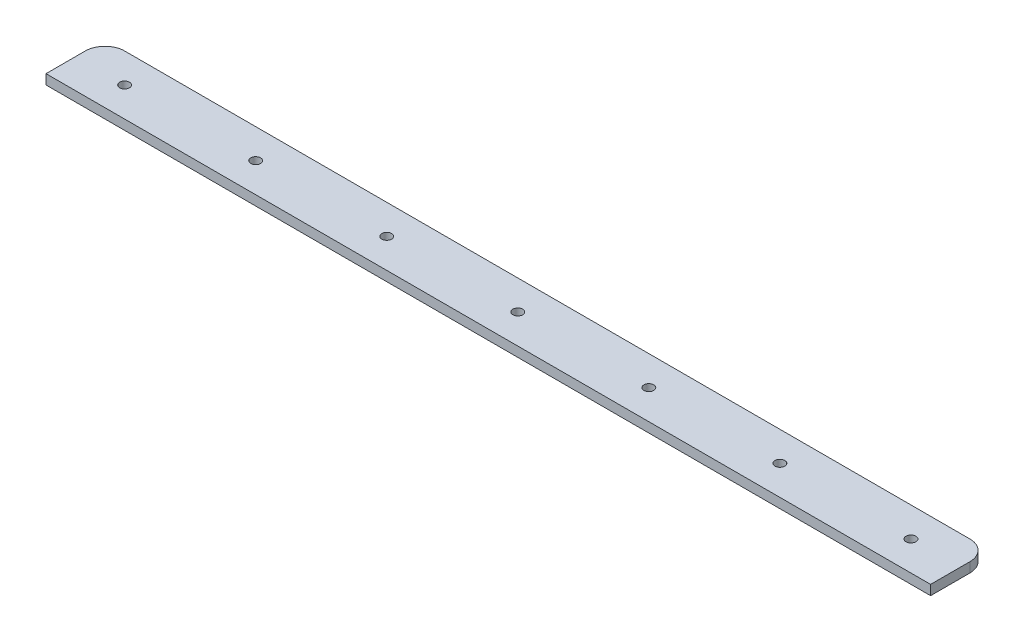
ISO-10303-21;
HEADER;
FILE_DESCRIPTION(('STEP AP214'),'2;1');
FILE_NAME('part.step','',(''),(''),'','','');
FILE_SCHEMA(('AUTOMOTIVE_DESIGN { 1 0 10303 214 1 1 1 1 }'));
ENDSEC;
DATA;
#1=APPLICATION_CONTEXT('core data for automotive mechanical design processes');
#2=APPLICATION_PROTOCOL_DEFINITION('international standard','automotive_design',2000,#1);
#3=PRODUCT_CONTEXT('',#1,'mechanical');
#4=PRODUCT('Part','Part','',(#3));
#5=PRODUCT_RELATED_PRODUCT_CATEGORY('part','',(#4));
#6=PRODUCT_DEFINITION_FORMATION('','',#4);
#7=PRODUCT_DEFINITION_CONTEXT('part definition',#1,'design');
#8=PRODUCT_DEFINITION('design','',#6,#7);
#9=PRODUCT_DEFINITION_SHAPE('','',#8);
#10=(LENGTH_UNIT() NAMED_UNIT(*) SI_UNIT(.MILLI.,.METRE.));
#11=(NAMED_UNIT(*) PLANE_ANGLE_UNIT() SI_UNIT($,.RADIAN.));
#12=(NAMED_UNIT(*) SI_UNIT($,.STERADIAN.) SOLID_ANGLE_UNIT());
#13=UNCERTAINTY_MEASURE_WITH_UNIT(LENGTH_MEASURE(1.E-05),#10,'distance_accuracy_value','');
#14=(GEOMETRIC_REPRESENTATION_CONTEXT(3) GLOBAL_UNCERTAINTY_ASSIGNED_CONTEXT((#13)) GLOBAL_UNIT_ASSIGNED_CONTEXT((#10,
#11,#12)) REPRESENTATION_CONTEXT('',''));
#15=CARTESIAN_POINT('',(0.,0.,0.));
#16=DIRECTION('',(0.,0.,1.));
#17=DIRECTION('',(1.,0.,0.));
#18=AXIS2_PLACEMENT_3D('',#15,#16,#17);
#19=CARTESIAN_POINT('',(-750.,7.5,17.7838602817301));
#20=DIRECTION('',(1.,0.,0.));
#21=DIRECTION('',(0.,0.,-1.));
#22=AXIS2_PLACEMENT_3D('',#19,#20,#21);
#23=PLANE('',#22);
#24=DIRECTION('',(0.,0.,1.));
#25=VECTOR('',#24,1.);
#26=CARTESIAN_POINT('',(-750.,-7.5,17.7838602817301));
#27=LINE('',#26,#25);
#28=CARTESIAN_POINT('',(-750.,-7.5,-42.2161397182699));
#29=VERTEX_POINT('',#28);
#30=CARTESIAN_POINT('',(-750.,-7.5,17.7838602817301));
#31=VERTEX_POINT('',#30);
#32=EDGE_CURVE('E121',#29,#31,#27,.T.);
#33=ORIENTED_EDGE('',*,*,#32,.T.);
#34=DIRECTION('',(0.,-1.,0.));
#35=VECTOR('',#34,1.);
#36=CARTESIAN_POINT('',(-750.,7.5,17.7838602817301));
#37=LINE('',#36,#35);
#38=CARTESIAN_POINT('',(-750.,7.5,17.7838602817301));
#39=VERTEX_POINT('',#38);
#40=EDGE_CURVE('E11',#39,#31,#37,.T.);
#41=ORIENTED_EDGE('',*,*,#40,.F.);
#42=DIRECTION('',(0.,0.,1.));
#43=VECTOR('',#42,1.);
#44=CARTESIAN_POINT('',(-750.,7.5,17.7838602817301));
#45=LINE('',#44,#43);
#46=CARTESIAN_POINT('',(-750.,7.5,-42.2161397182699));
#47=VERTEX_POINT('',#46);
#48=EDGE_CURVE('E132',#47,#39,#45,.T.);
#49=ORIENTED_EDGE('',*,*,#48,.F.);
#50=DIRECTION('',(0.,-1.,0.));
#51=VECTOR('',#50,1.);
#52=CARTESIAN_POINT('',(-750.,7.5,-42.2161397182699));
#53=LINE('',#52,#51);
#54=EDGE_CURVE('E117',#47,#29,#53,.T.);
#55=ORIENTED_EDGE('',*,*,#54,.T.);
#56=EDGE_LOOP('',(#33,#41,#49,#55));
#57=FACE_BOUND('',#56,.T.);
#58=ADVANCED_FACE('F37',(#57),#23,.F.);
#59=CARTESIAN_POINT('',(-750.,7.5,17.7838602817301));
#60=DIRECTION('',(0.,0.,-1.));
#61=DIRECTION('',(-1.,0.,0.));
#62=AXIS2_PLACEMENT_3D('',#59,#60,#61);
#63=PLANE('',#62);
#64=DIRECTION('',(1.,0.,0.));
#65=VECTOR('',#64,1.);
#66=CARTESIAN_POINT('',(-750.,-7.5,17.7838602817301));
#67=LINE('',#66,#65);
#68=CARTESIAN_POINT('',(600.,-7.5,17.7838602817301));
#69=VERTEX_POINT('',#68);
#70=EDGE_CURVE('E124',#31,#69,#67,.T.);
#71=ORIENTED_EDGE('',*,*,#70,.T.);
#72=DIRECTION('',(0.,-1.,0.));
#73=VECTOR('',#72,1.);
#74=CARTESIAN_POINT('',(600.,7.5,17.7838602817301));
#75=LINE('',#74,#73);
#76=CARTESIAN_POINT('',(600.,7.5,17.7838602817301));
#77=VERTEX_POINT('',#76);
#78=EDGE_CURVE('E45',#77,#69,#75,.T.);
#79=ORIENTED_EDGE('',*,*,#78,.F.);
#80=DIRECTION('',(1.,0.,0.));
#81=VECTOR('',#80,1.);
#82=CARTESIAN_POINT('',(-750.,7.5,17.7838602817301));
#83=LINE('',#82,#81);
#84=EDGE_CURVE('E90',#39,#77,#83,.T.);
#85=ORIENTED_EDGE('',*,*,#84,.F.);
#86=ORIENTED_EDGE('',*,*,#40,.T.);
#87=EDGE_LOOP('',(#71,#79,#85,#86));
#88=FACE_BOUND('',#87,.T.);
#89=ADVANCED_FACE('F157',(#88),#63,.F.);
#90=CARTESIAN_POINT('',(600.,7.5,17.7838602817301));
#91=DIRECTION('',(-1.,0.,0.));
#92=DIRECTION('',(0.,0.,1.));
#93=AXIS2_PLACEMENT_3D('',#90,#91,#92);
#94=PLANE('',#93);
#95=DIRECTION('',(0.,0.,-1.));
#96=VECTOR('',#95,1.);
#97=CARTESIAN_POINT('',(600.,-7.5,17.7838602817301));
#98=LINE('',#97,#96);
#99=CARTESIAN_POINT('',(600.,-7.5,-42.2161397182699));
#100=VERTEX_POINT('',#99);
#101=EDGE_CURVE('E127',#69,#100,#98,.T.);
#102=ORIENTED_EDGE('',*,*,#101,.T.);
#103=DIRECTION('',(0.,-1.,0.));
#104=VECTOR('',#103,1.);
#105=CARTESIAN_POINT('',(600.,7.5,-42.2161397182699));
#106=LINE('',#105,#104);
#107=CARTESIAN_POINT('',(600.,7.5,-42.2161397182699));
#108=VERTEX_POINT('',#107);
#109=EDGE_CURVE('E112',#108,#100,#106,.T.);
#110=ORIENTED_EDGE('',*,*,#109,.F.);
#111=DIRECTION('',(0.,0.,-1.));
#112=VECTOR('',#111,1.);
#113=CARTESIAN_POINT('',(600.,7.5,17.7838602817301));
#114=LINE('',#113,#112);
#115=EDGE_CURVE('E103',#77,#108,#114,.T.);
#116=ORIENTED_EDGE('',*,*,#115,.F.);
#117=ORIENTED_EDGE('',*,*,#78,.T.);
#118=EDGE_LOOP('',(#102,#110,#116,#117));
#119=FACE_BOUND('',#118,.T.);
#120=ADVANCED_FACE('F138',(#119),#94,.F.);
#121=CARTESIAN_POINT('',(570.,7.5,-42.2161397182699));
#122=DIRECTION('',(0.,-1.,0.));
#123=DIRECTION('',(0.,0.,-1.));
#124=AXIS2_PLACEMENT_3D('',#121,#122,#123);
#125=CYLINDRICAL_SURFACE('',#124,30.0000000000001);
#126=CARTESIAN_POINT('',(570.,-7.5,-42.2161397182699));
#127=DIRECTION('',(0.,1.,0.));
#128=DIRECTION('',(0.,0.,-1.));
#129=AXIS2_PLACEMENT_3D('',#126,#127,#128);
#130=CIRCLE('',#129,30.0000000000001);
#131=CARTESIAN_POINT('',(570.,-7.5,-72.21613971827));
#132=VERTEX_POINT('',#131);
#133=EDGE_CURVE('E111',#100,#132,#130,.T.);
#134=ORIENTED_EDGE('',*,*,#133,.T.);
#135=DIRECTION('',(0.,-1.,0.));
#136=VECTOR('',#135,1.);
#137=CARTESIAN_POINT('',(570.,7.5,-72.21613971827));
#138=LINE('',#137,#136);
#139=CARTESIAN_POINT('',(570.,7.5,-72.21613971827));
#140=VERTEX_POINT('',#139);
#141=EDGE_CURVE('E108',#140,#132,#138,.T.);
#142=ORIENTED_EDGE('',*,*,#141,.F.);
#143=CARTESIAN_POINT('',(570.,7.5,-42.2161397182699));
#144=DIRECTION('',(0.,1.,0.));
#145=DIRECTION('',(0.,0.,-1.));
#146=AXIS2_PLACEMENT_3D('',#143,#144,#145);
#147=CIRCLE('',#146,30.0000000000001);
#148=EDGE_CURVE('E97',#108,#140,#147,.T.);
#149=ORIENTED_EDGE('',*,*,#148,.F.);
#150=ORIENTED_EDGE('',*,*,#109,.T.);
#151=EDGE_LOOP('',(#134,#142,#149,#150));
#152=FACE_BOUND('',#151,.T.);
#153=ADVANCED_FACE('F109',(#152),#125,.T.);
#154=CARTESIAN_POINT('',(-720.,7.5,-72.2161397182699));
#155=DIRECTION('',(0.,0.,1.));
#156=DIRECTION('',(1.,0.,0.));
#157=AXIS2_PLACEMENT_3D('',#154,#155,#156);
#158=PLANE('',#157);
#159=DIRECTION('',(-1.,0.,0.));
#160=VECTOR('',#159,1.);
#161=CARTESIAN_POINT('',(-720.,-7.5,-72.2161397182699));
#162=LINE('',#161,#160);
#163=CARTESIAN_POINT('',(-720.,-7.5,-72.2161397182699));
#164=VERTEX_POINT('',#163);
#165=EDGE_CURVE('E76',#132,#164,#162,.T.);
#166=ORIENTED_EDGE('',*,*,#165,.T.);
#167=DIRECTION('',(0.,-1.,0.));
#168=VECTOR('',#167,1.);
#169=CARTESIAN_POINT('',(-720.,7.5,-72.2161397182699));
#170=LINE('',#169,#168);
#171=CARTESIAN_POINT('',(-720.,7.5,-72.2161397182699));
#172=VERTEX_POINT('',#171);
#173=EDGE_CURVE('E113',#172,#164,#170,.T.);
#174=ORIENTED_EDGE('',*,*,#173,.F.);
#175=DIRECTION('',(-1.,0.,0.));
#176=VECTOR('',#175,1.);
#177=CARTESIAN_POINT('',(-720.,7.5,-72.2161397182699));
#178=LINE('',#177,#176);
#179=EDGE_CURVE('E101',#140,#172,#178,.T.);
#180=ORIENTED_EDGE('',*,*,#179,.F.);
#181=ORIENTED_EDGE('',*,*,#141,.T.);
#182=EDGE_LOOP('',(#166,#174,#180,#181));
#183=FACE_BOUND('',#182,.T.);
#184=ADVANCED_FACE('F115',(#183),#158,.F.);
#185=CARTESIAN_POINT('',(-720.,7.5,-42.2161397182699));
#186=DIRECTION('',(0.,-1.,0.));
#187=DIRECTION('',(0.,0.,-1.));
#188=AXIS2_PLACEMENT_3D('',#185,#186,#187);
#189=CYLINDRICAL_SURFACE('',#188,30.);
#190=CARTESIAN_POINT('',(-720.,-7.5,-42.2161397182699));
#191=DIRECTION('',(0.,1.,0.));
#192=DIRECTION('',(0.,0.,-1.));
#193=AXIS2_PLACEMENT_3D('',#190,#191,#192);
#194=CIRCLE('',#193,30.);
#195=EDGE_CURVE('E82',#164,#29,#194,.T.);
#196=ORIENTED_EDGE('',*,*,#195,.T.);
#197=ORIENTED_EDGE('',*,*,#54,.F.);
#198=CARTESIAN_POINT('',(-720.,7.5,-42.2161397182699));
#199=DIRECTION('',(0.,1.,0.));
#200=DIRECTION('',(0.,0.,-1.));
#201=AXIS2_PLACEMENT_3D('',#198,#199,#200);
#202=CIRCLE('',#201,30.);
#203=EDGE_CURVE('E53',#172,#47,#202,.T.);
#204=ORIENTED_EDGE('',*,*,#203,.F.);
#205=ORIENTED_EDGE('',*,*,#173,.T.);
#206=EDGE_LOOP('',(#196,#197,#204,#205));
#207=FACE_BOUND('',#206,.T.);
#208=ADVANCED_FACE('F145',(#207),#189,.T.);
#209=CARTESIAN_POINT('',(-720.,7.5,-42.2161397182699));
#210=DIRECTION('',(0.,-1.,0.));
#211=DIRECTION('',(0.,0.,-1.));
#212=AXIS2_PLACEMENT_3D('',#209,#210,#211);
#213=PLANE('',#212);
#214=CARTESIAN_POINT('',(-675.,7.5,-27.21613971827));
#215=DIRECTION('',(0.,-1.,0.));
#216=DIRECTION('',(0.,0.,-1.));
#217=AXIS2_PLACEMENT_3D('',#214,#215,#216);
#218=CIRCLE('',#217,7.49999999999995);
#219=CARTESIAN_POINT('',(-675.,7.5,-34.7161397182699));
#220=VERTEX_POINT('',#219);
#221=EDGE_CURVE('E125',#220,#220,#218,.T.);
#222=ORIENTED_EDGE('',*,*,#221,.T.);
#223=EDGE_LOOP('',(#222));
#224=FACE_BOUND('',#223,.T.);
#225=CARTESIAN_POINT('',(-475.,7.5,-27.21613971827));
#226=DIRECTION('',(0.,-1.,0.));
#227=DIRECTION('',(0.,0.,-1.));
#228=AXIS2_PLACEMENT_3D('',#225,#226,#227);
#229=CIRCLE('',#228,7.50000000000007);
#230=CARTESIAN_POINT('',(-475.,7.5,-34.71613971827));
#231=VERTEX_POINT('',#230);
#232=EDGE_CURVE('E321',#231,#231,#229,.T.);
#233=ORIENTED_EDGE('',*,*,#232,.T.);
#234=EDGE_LOOP('',(#233));
#235=FACE_BOUND('',#234,.T.);
#236=CARTESIAN_POINT('',(-275.,7.5,-27.21613971827));
#237=DIRECTION('',(0.,-1.,0.));
#238=DIRECTION('',(0.,0.,-1.));
#239=AXIS2_PLACEMENT_3D('',#236,#237,#238);
#240=CIRCLE('',#239,7.50000000000001);
#241=CARTESIAN_POINT('',(-275.,7.5,-34.71613971827));
#242=VERTEX_POINT('',#241);
#243=EDGE_CURVE('E329',#242,#242,#240,.T.);
#244=ORIENTED_EDGE('',*,*,#243,.T.);
#245=EDGE_LOOP('',(#244));
#246=FACE_BOUND('',#245,.T.);
#247=CARTESIAN_POINT('',(-75.0000000000002,7.5,-27.21613971827));
#248=DIRECTION('',(0.,-1.,0.));
#249=DIRECTION('',(0.,0.,-1.));
#250=AXIS2_PLACEMENT_3D('',#247,#248,#249);
#251=CIRCLE('',#250,7.50000000000001);
#252=CARTESIAN_POINT('',(-75.0000000000002,7.5,-34.71613971827));
#253=VERTEX_POINT('',#252);
#254=EDGE_CURVE('E335',#253,#253,#251,.T.);
#255=ORIENTED_EDGE('',*,*,#254,.T.);
#256=EDGE_LOOP('',(#255));
#257=FACE_BOUND('',#256,.T.);
#258=CARTESIAN_POINT('',(125.,7.5,-27.21613971827));
#259=DIRECTION('',(0.,-1.,0.));
#260=DIRECTION('',(0.,0.,-1.));
#261=AXIS2_PLACEMENT_3D('',#258,#259,#260);
#262=CIRCLE('',#261,7.50000000000001);
#263=CARTESIAN_POINT('',(125.,7.5,-34.71613971827));
#264=VERTEX_POINT('',#263);
#265=EDGE_CURVE('E341',#264,#264,#262,.T.);
#266=ORIENTED_EDGE('',*,*,#265,.T.);
#267=EDGE_LOOP('',(#266));
#268=FACE_BOUND('',#267,.T.);
#269=CARTESIAN_POINT('',(325.,7.5,-27.21613971827));
#270=DIRECTION('',(0.,-1.,0.));
#271=DIRECTION('',(0.,0.,-1.));
#272=AXIS2_PLACEMENT_3D('',#269,#270,#271);
#273=CIRCLE('',#272,7.50000000000001);
#274=CARTESIAN_POINT('',(325.,7.5,-34.71613971827));
#275=VERTEX_POINT('',#274);
#276=EDGE_CURVE('E347',#275,#275,#273,.T.);
#277=ORIENTED_EDGE('',*,*,#276,.T.);
#278=EDGE_LOOP('',(#277));
#279=FACE_BOUND('',#278,.T.);
#280=CARTESIAN_POINT('',(525.,7.5,-27.21613971827));
#281=DIRECTION('',(0.,-1.,0.));
#282=DIRECTION('',(0.,0.,-1.));
#283=AXIS2_PLACEMENT_3D('',#280,#281,#282);
#284=CIRCLE('',#283,7.50000000000007);
#285=CARTESIAN_POINT('',(525.,7.5,-34.71613971827));
#286=VERTEX_POINT('',#285);
#287=EDGE_CURVE('E353',#286,#286,#284,.T.);
#288=ORIENTED_EDGE('',*,*,#287,.T.);
#289=EDGE_LOOP('',(#288));
#290=FACE_BOUND('',#289,.T.);
#291=ORIENTED_EDGE('',*,*,#48,.T.);
#292=ORIENTED_EDGE('',*,*,#84,.T.);
#293=ORIENTED_EDGE('',*,*,#115,.T.);
#294=ORIENTED_EDGE('',*,*,#148,.T.);
#295=ORIENTED_EDGE('',*,*,#179,.T.);
#296=ORIENTED_EDGE('',*,*,#203,.T.);
#297=EDGE_LOOP('',(#291,#292,#293,#294,#295,#296));
#298=FACE_BOUND('',#297,.T.);
#299=ADVANCED_FACE('F99',(#224,#235,#246,#257,#268,#279,#290,#298),#213,.F.);
#300=CARTESIAN_POINT('',(-720.,-7.5,-42.2161397182699));
#301=DIRECTION('',(0.,-1.,0.));
#302=DIRECTION('',(0.,0.,-1.));
#303=AXIS2_PLACEMENT_3D('',#300,#301,#302);
#304=PLANE('',#303);
#305=CARTESIAN_POINT('',(-675.,-7.5,-27.21613971827));
#306=DIRECTION('',(0.,-1.,0.));
#307=DIRECTION('',(0.,0.,-1.));
#308=AXIS2_PLACEMENT_3D('',#305,#306,#307);
#309=CIRCLE('',#308,7.49999999999995);
#310=CARTESIAN_POINT('',(-675.,-7.5,-34.7161397182699));
#311=VERTEX_POINT('',#310);
#312=EDGE_CURVE('E316',#311,#311,#309,.T.);
#313=ORIENTED_EDGE('',*,*,#312,.F.);
#314=EDGE_LOOP('',(#313));
#315=FACE_BOUND('',#314,.T.);
#316=CARTESIAN_POINT('',(-475.,-7.5,-27.21613971827));
#317=DIRECTION('',(0.,-1.,0.));
#318=DIRECTION('',(0.,0.,-1.));
#319=AXIS2_PLACEMENT_3D('',#316,#317,#318);
#320=CIRCLE('',#319,7.50000000000007);
#321=CARTESIAN_POINT('',(-475.,-7.5,-34.71613971827));
#322=VERTEX_POINT('',#321);
#323=EDGE_CURVE('E317',#322,#322,#320,.T.);
#324=ORIENTED_EDGE('',*,*,#323,.F.);
#325=EDGE_LOOP('',(#324));
#326=FACE_BOUND('',#325,.T.);
#327=CARTESIAN_POINT('',(-275.,-7.5,-27.21613971827));
#328=DIRECTION('',(0.,-1.,0.));
#329=DIRECTION('',(0.,0.,-1.));
#330=AXIS2_PLACEMENT_3D('',#327,#328,#329);
#331=CIRCLE('',#330,7.50000000000001);
#332=CARTESIAN_POINT('',(-275.,-7.5,-34.71613971827));
#333=VERTEX_POINT('',#332);
#334=EDGE_CURVE('E326',#333,#333,#331,.T.);
#335=ORIENTED_EDGE('',*,*,#334,.F.);
#336=EDGE_LOOP('',(#335));
#337=FACE_BOUND('',#336,.T.);
#338=CARTESIAN_POINT('',(-75.0000000000002,-7.5,-27.21613971827));
#339=DIRECTION('',(0.,-1.,0.));
#340=DIRECTION('',(0.,0.,-1.));
#341=AXIS2_PLACEMENT_3D('',#338,#339,#340);
#342=CIRCLE('',#341,7.50000000000001);
#343=CARTESIAN_POINT('',(-75.0000000000002,-7.5,-34.71613971827));
#344=VERTEX_POINT('',#343);
#345=EDGE_CURVE('E332',#344,#344,#342,.T.);
#346=ORIENTED_EDGE('',*,*,#345,.F.);
#347=EDGE_LOOP('',(#346));
#348=FACE_BOUND('',#347,.T.);
#349=CARTESIAN_POINT('',(125.,-7.5,-27.21613971827));
#350=DIRECTION('',(0.,-1.,0.));
#351=DIRECTION('',(0.,0.,-1.));
#352=AXIS2_PLACEMENT_3D('',#349,#350,#351);
#353=CIRCLE('',#352,7.50000000000001);
#354=CARTESIAN_POINT('',(125.,-7.5,-34.71613971827));
#355=VERTEX_POINT('',#354);
#356=EDGE_CURVE('E338',#355,#355,#353,.T.);
#357=ORIENTED_EDGE('',*,*,#356,.F.);
#358=EDGE_LOOP('',(#357));
#359=FACE_BOUND('',#358,.T.);
#360=CARTESIAN_POINT('',(325.,-7.5,-27.21613971827));
#361=DIRECTION('',(0.,-1.,0.));
#362=DIRECTION('',(0.,0.,-1.));
#363=AXIS2_PLACEMENT_3D('',#360,#361,#362);
#364=CIRCLE('',#363,7.50000000000001);
#365=CARTESIAN_POINT('',(325.,-7.5,-34.71613971827));
#366=VERTEX_POINT('',#365);
#367=EDGE_CURVE('E344',#366,#366,#364,.T.);
#368=ORIENTED_EDGE('',*,*,#367,.F.);
#369=EDGE_LOOP('',(#368));
#370=FACE_BOUND('',#369,.T.);
#371=CARTESIAN_POINT('',(525.,-7.5,-27.21613971827));
#372=DIRECTION('',(0.,-1.,0.));
#373=DIRECTION('',(0.,0.,-1.));
#374=AXIS2_PLACEMENT_3D('',#371,#372,#373);
#375=CIRCLE('',#374,7.50000000000007);
#376=CARTESIAN_POINT('',(525.,-7.5,-34.71613971827));
#377=VERTEX_POINT('',#376);
#378=EDGE_CURVE('E350',#377,#377,#375,.T.);
#379=ORIENTED_EDGE('',*,*,#378,.F.);
#380=EDGE_LOOP('',(#379));
#381=FACE_BOUND('',#380,.T.);
#382=ORIENTED_EDGE('',*,*,#32,.F.);
#383=ORIENTED_EDGE('',*,*,#195,.F.);
#384=ORIENTED_EDGE('',*,*,#165,.F.);
#385=ORIENTED_EDGE('',*,*,#133,.F.);
#386=ORIENTED_EDGE('',*,*,#101,.F.);
#387=ORIENTED_EDGE('',*,*,#70,.F.);
#388=EDGE_LOOP('',(#382,#383,#384,#385,#386,#387));
#389=FACE_BOUND('',#388,.T.);
#390=ADVANCED_FACE('F141',(#315,#326,#337,#348,#359,#370,#381,#389),#304,.T.);
#391=CARTESIAN_POINT('',(525.,7.5,-27.21613971827));
#392=DIRECTION('',(0.,-1.,0.));
#393=DIRECTION('',(0.,0.,-1.));
#394=AXIS2_PLACEMENT_3D('',#391,#392,#393);
#395=CYLINDRICAL_SURFACE('',#394,7.50000000000007);
#396=ORIENTED_EDGE('',*,*,#287,.F.);
#397=EDGE_LOOP('',(#396));
#398=FACE_BOUND('',#397,.T.);
#399=ORIENTED_EDGE('',*,*,#378,.T.);
#400=EDGE_LOOP('',(#399));
#401=FACE_BOUND('',#400,.T.);
#402=ADVANCED_FACE('F197',(#398,#401),#395,.F.);
#403=CARTESIAN_POINT('',(325.,7.5,-27.21613971827));
#404=DIRECTION('',(0.,-1.,0.));
#405=DIRECTION('',(0.,0.,-1.));
#406=AXIS2_PLACEMENT_3D('',#403,#404,#405);
#407=CYLINDRICAL_SURFACE('',#406,7.50000000000001);
#408=ORIENTED_EDGE('',*,*,#276,.F.);
#409=EDGE_LOOP('',(#408));
#410=FACE_BOUND('',#409,.T.);
#411=ORIENTED_EDGE('',*,*,#367,.T.);
#412=EDGE_LOOP('',(#411));
#413=FACE_BOUND('',#412,.T.);
#414=ADVANCED_FACE('F207',(#410,#413),#407,.F.);
#415=CARTESIAN_POINT('',(125.,7.5,-27.21613971827));
#416=DIRECTION('',(0.,-1.,0.));
#417=DIRECTION('',(0.,0.,-1.));
#418=AXIS2_PLACEMENT_3D('',#415,#416,#417);
#419=CYLINDRICAL_SURFACE('',#418,7.50000000000001);
#420=ORIENTED_EDGE('',*,*,#265,.F.);
#421=EDGE_LOOP('',(#420));
#422=FACE_BOUND('',#421,.T.);
#423=ORIENTED_EDGE('',*,*,#356,.T.);
#424=EDGE_LOOP('',(#423));
#425=FACE_BOUND('',#424,.T.);
#426=ADVANCED_FACE('F218',(#422,#425),#419,.F.);
#427=CARTESIAN_POINT('',(-75.0000000000002,7.5,-27.21613971827));
#428=DIRECTION('',(0.,-1.,0.));
#429=DIRECTION('',(0.,0.,-1.));
#430=AXIS2_PLACEMENT_3D('',#427,#428,#429);
#431=CYLINDRICAL_SURFACE('',#430,7.50000000000001);
#432=ORIENTED_EDGE('',*,*,#254,.F.);
#433=EDGE_LOOP('',(#432));
#434=FACE_BOUND('',#433,.T.);
#435=ORIENTED_EDGE('',*,*,#345,.T.);
#436=EDGE_LOOP('',(#435));
#437=FACE_BOUND('',#436,.T.);
#438=ADVANCED_FACE('F229',(#434,#437),#431,.F.);
#439=CARTESIAN_POINT('',(-275.,7.5,-27.21613971827));
#440=DIRECTION('',(0.,-1.,0.));
#441=DIRECTION('',(0.,0.,-1.));
#442=AXIS2_PLACEMENT_3D('',#439,#440,#441);
#443=CYLINDRICAL_SURFACE('',#442,7.50000000000001);
#444=ORIENTED_EDGE('',*,*,#243,.F.);
#445=EDGE_LOOP('',(#444));
#446=FACE_BOUND('',#445,.T.);
#447=ORIENTED_EDGE('',*,*,#334,.T.);
#448=EDGE_LOOP('',(#447));
#449=FACE_BOUND('',#448,.T.);
#450=ADVANCED_FACE('F240',(#446,#449),#443,.F.);
#451=CARTESIAN_POINT('',(-475.,7.5,-27.21613971827));
#452=DIRECTION('',(0.,-1.,0.));
#453=DIRECTION('',(0.,0.,-1.));
#454=AXIS2_PLACEMENT_3D('',#451,#452,#453);
#455=CYLINDRICAL_SURFACE('',#454,7.50000000000007);
#456=ORIENTED_EDGE('',*,*,#232,.F.);
#457=EDGE_LOOP('',(#456));
#458=FACE_BOUND('',#457,.T.);
#459=ORIENTED_EDGE('',*,*,#323,.T.);
#460=EDGE_LOOP('',(#459));
#461=FACE_BOUND('',#460,.T.);
#462=ADVANCED_FACE('F251',(#458,#461),#455,.F.);
#463=CARTESIAN_POINT('',(-675.,7.5,-27.21613971827));
#464=DIRECTION('',(0.,-1.,0.));
#465=DIRECTION('',(0.,0.,-1.));
#466=AXIS2_PLACEMENT_3D('',#463,#464,#465);
#467=CYLINDRICAL_SURFACE('',#466,7.49999999999995);
#468=ORIENTED_EDGE('',*,*,#221,.F.);
#469=EDGE_LOOP('',(#468));
#470=FACE_BOUND('',#469,.T.);
#471=ORIENTED_EDGE('',*,*,#312,.T.);
#472=EDGE_LOOP('',(#471));
#473=FACE_BOUND('',#472,.T.);
#474=ADVANCED_FACE('F262',(#470,#473),#467,.F.);
#475=CLOSED_SHELL('',(#58,#89,#120,#153,#184,#208,#299,#390,#402,#414,#426,#438,#450,#462,#474));
#476=MANIFOLD_SOLID_BREP('B2',#475);
#477=ADVANCED_BREP_SHAPE_REPRESENTATION('',(#18,#476),#14);
#478=SHAPE_DEFINITION_REPRESENTATION(#9,#477);
ENDSEC;
END-ISO-10303-21;
